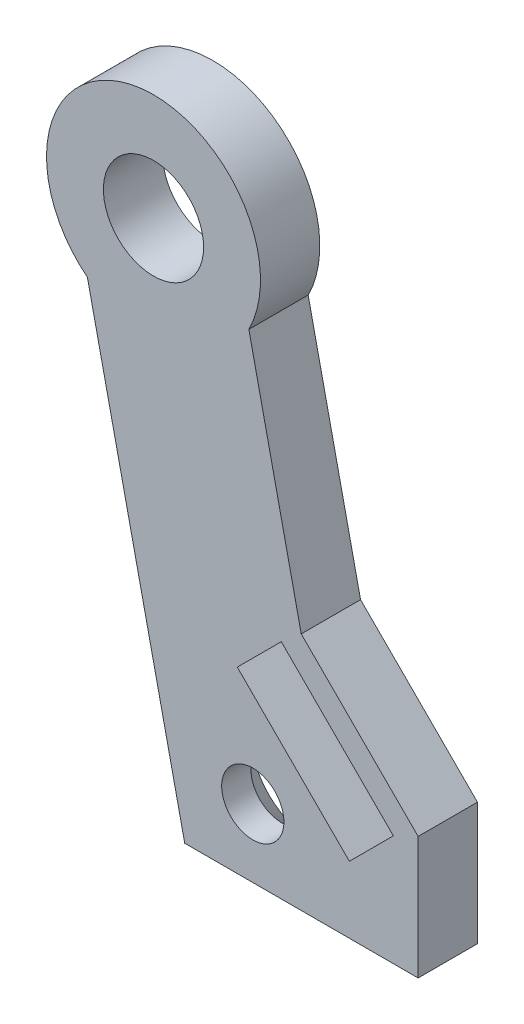
ISO-10303-21;
HEADER;
FILE_DESCRIPTION(('STEP AP214'),'2;1');
FILE_NAME('part.step','',(''),(''),'','','');
FILE_SCHEMA(('AUTOMOTIVE_DESIGN { 1 0 10303 214 1 1 1 1 }'));
ENDSEC;
DATA;
#1=APPLICATION_CONTEXT('core data for automotive mechanical design processes');
#2=APPLICATION_PROTOCOL_DEFINITION('international standard','automotive_design',2000,#1);
#3=PRODUCT_CONTEXT('',#1,'mechanical');
#4=PRODUCT('Part','Part','',(#3));
#5=PRODUCT_RELATED_PRODUCT_CATEGORY('part','',(#4));
#6=PRODUCT_DEFINITION_FORMATION('','',#4);
#7=PRODUCT_DEFINITION_CONTEXT('part definition',#1,'design');
#8=PRODUCT_DEFINITION('design','',#6,#7);
#9=PRODUCT_DEFINITION_SHAPE('','',#8);
#10=(LENGTH_UNIT() NAMED_UNIT(*) SI_UNIT(.MILLI.,.METRE.));
#11=(NAMED_UNIT(*) PLANE_ANGLE_UNIT() SI_UNIT($,.RADIAN.));
#12=(NAMED_UNIT(*) SI_UNIT($,.STERADIAN.) SOLID_ANGLE_UNIT());
#13=UNCERTAINTY_MEASURE_WITH_UNIT(LENGTH_MEASURE(1.E-05),#10,'distance_accuracy_value','');
#14=(GEOMETRIC_REPRESENTATION_CONTEXT(3) GLOBAL_UNCERTAINTY_ASSIGNED_CONTEXT((#13)) GLOBAL_UNIT_ASSIGNED_CONTEXT((#10,
#11,#12)) REPRESENTATION_CONTEXT('',''));
#15=CARTESIAN_POINT('',(0.,0.,0.));
#16=DIRECTION('',(0.,0.,1.));
#17=DIRECTION('',(1.,0.,0.));
#18=AXIS2_PLACEMENT_3D('',#15,#16,#17);
#19=CARTESIAN_POINT('',(8.20970869120796,8.20970869120796,-3.05));
#20=DIRECTION('',(0.707106781186548,0.707106781186547,0.));
#21=DIRECTION('',(-0.707106781186547,0.707106781186548,0.));
#22=AXIS2_PLACEMENT_3D('',#19,#20,#21);
#23=PLANE('',#22);
#24=DIRECTION('',(0.707106781186547,-0.707106781186548,0.));
#25=VECTOR('',#24,1.);
#26=CARTESIAN_POINT('',(8.20970869120796,8.20970869120796,0.));
#27=LINE('',#26,#25);
#28=CARTESIAN_POINT('',(4.96428752719385,11.4551298552221,0.));
#29=VERTEX_POINT('',#28);
#30=CARTESIAN_POINT('',(10.7272077938642,5.6922095885517,0.));
#31=VERTEX_POINT('',#30);
#32=EDGE_CURVE('E190',#29,#31,#27,.T.);
#33=ORIENTED_EDGE('',*,*,#32,.F.);
#34=DIRECTION('',(0.,0.,1.));
#35=VECTOR('',#34,1.);
#36=CARTESIAN_POINT('',(4.96428752719385,11.4551298552221,-3.05));
#37=LINE('',#36,#35);
#38=CARTESIAN_POINT('',(4.96428752719385,11.4551298552221,-3.05));
#39=VERTEX_POINT('',#38);
#40=EDGE_CURVE('E201',#39,#29,#37,.T.);
#41=ORIENTED_EDGE('',*,*,#40,.F.);
#42=DIRECTION('',(0.707106781186547,-0.707106781186548,0.));
#43=VECTOR('',#42,1.);
#44=CARTESIAN_POINT('',(8.20970869120796,8.20970869120796,-3.05));
#45=LINE('',#44,#43);
#46=CARTESIAN_POINT('',(10.7272077938642,5.6922095885517,-3.05));
#47=VERTEX_POINT('',#46);
#48=EDGE_CURVE('E155',#39,#47,#45,.T.);
#49=ORIENTED_EDGE('',*,*,#48,.T.);
#50=DIRECTION('',(0.,0.,1.));
#51=VECTOR('',#50,1.);
#52=CARTESIAN_POINT('',(10.7272077938642,5.6922095885517,-3.05));
#53=LINE('',#52,#51);
#54=EDGE_CURVE('E11',#47,#31,#53,.T.);
#55=ORIENTED_EDGE('',*,*,#54,.T.);
#56=EDGE_LOOP('',(#33,#41,#49,#55));
#57=FACE_BOUND('',#56,.T.);
#58=ADVANCED_FACE('F49',(#57),#23,.F.);
#59=CARTESIAN_POINT('',(2.51749910265625,-2.51749910265625,-3.05));
#60=DIRECTION('',(-0.707106781186548,0.707106781186548,0.));
#61=DIRECTION('',(-0.707106781186548,-0.707106781186548,0.));
#62=AXIS2_PLACEMENT_3D('',#59,#60,#61);
#63=PLANE('',#62);
#64=DIRECTION('',(0.707106781186548,0.707106781186548,0.));
#65=VECTOR('',#64,1.);
#66=CARTESIAN_POINT('',(2.51749910265625,-2.51749910265625,0.));
#67=LINE('',#66,#65);
#68=CARTESIAN_POINT('',(8.46446609406726,3.42946788875475,0.));
#69=VERTEX_POINT('',#68);
#70=EDGE_CURVE('E193',#69,#31,#67,.T.);
#71=ORIENTED_EDGE('',*,*,#70,.T.);
#72=ORIENTED_EDGE('',*,*,#54,.F.);
#73=DIRECTION('',(0.707106781186548,0.707106781186548,0.));
#74=VECTOR('',#73,1.);
#75=CARTESIAN_POINT('',(2.51749910265625,-2.51749910265625,-3.05));
#76=LINE('',#75,#74);
#77=CARTESIAN_POINT('',(8.46446609406726,3.42946788875475,-3.05));
#78=VERTEX_POINT('',#77);
#79=EDGE_CURVE('E139',#78,#47,#76,.T.);
#80=ORIENTED_EDGE('',*,*,#79,.F.);
#81=DIRECTION('',(0.,0.,1.));
#82=VECTOR('',#81,1.);
#83=CARTESIAN_POINT('',(8.46446609406726,3.42946788875475,-3.05));
#84=LINE('',#83,#82);
#85=EDGE_CURVE('E60',#78,#69,#84,.T.);
#86=ORIENTED_EDGE('',*,*,#85,.T.);
#87=EDGE_LOOP('',(#71,#72,#80,#86));
#88=FACE_BOUND('',#87,.T.);
#89=ADVANCED_FACE('F152',(#88),#63,.T.);
#90=CARTESIAN_POINT('',(5.94696699141101,5.94696699141101,-3.05));
#91=DIRECTION('',(-0.707106781186547,-0.707106781186548,0.));
#92=DIRECTION('',(0.707106781186548,-0.707106781186547,0.));
#93=AXIS2_PLACEMENT_3D('',#90,#91,#92);
#94=PLANE('',#93);
#95=DIRECTION('',(-0.707106781186548,0.707106781186547,0.));
#96=VECTOR('',#95,1.);
#97=CARTESIAN_POINT('',(5.94696699141101,5.94696699141101,0.));
#98=LINE('',#97,#96);
#99=CARTESIAN_POINT('',(2.7015458273969,9.19238815542512,0.));
#100=VERTEX_POINT('',#99);
#101=EDGE_CURVE('E146',#69,#100,#98,.T.);
#102=ORIENTED_EDGE('',*,*,#101,.F.);
#103=ORIENTED_EDGE('',*,*,#85,.F.);
#104=DIRECTION('',(-0.707106781186548,0.707106781186547,0.));
#105=VECTOR('',#104,1.);
#106=CARTESIAN_POINT('',(5.94696699141101,5.94696699141101,-3.05));
#107=LINE('',#106,#105);
#108=CARTESIAN_POINT('',(2.7015458273969,9.19238815542512,-3.05));
#109=VERTEX_POINT('',#108);
#110=EDGE_CURVE('E135',#78,#109,#107,.T.);
#111=ORIENTED_EDGE('',*,*,#110,.T.);
#112=DIRECTION('',(0.,0.,1.));
#113=VECTOR('',#112,1.);
#114=CARTESIAN_POINT('',(2.7015458273969,9.19238815542512,-3.05));
#115=LINE('',#114,#113);
#116=EDGE_CURVE('E150',#109,#100,#115,.T.);
#117=ORIENTED_EDGE('',*,*,#116,.T.);
#118=EDGE_LOOP('',(#102,#103,#111,#117));
#119=FACE_BOUND('',#118,.T.);
#120=ADVANCED_FACE('F145',(#119),#94,.F.);
#121=CARTESIAN_POINT('',(-1.60499324348538,27.0243390124817,-3.05));
#122=DIRECTION('',(0.,0.,1.));
#123=DIRECTION('',(-1.,0.,0.));
#124=AXIS2_PLACEMENT_3D('',#121,#122,#123);
#125=CYLINDRICAL_SURFACE('',#124,5.5);
#126=CARTESIAN_POINT('',(-1.60499324348538,27.0243390124817,0.));
#127=DIRECTION('',(0.,0.,1.));
#128=DIRECTION('',(1.,0.,0.));
#129=AXIS2_PLACEMENT_3D('',#126,#127,#128);
#130=CIRCLE('',#129,5.5);
#131=CARTESIAN_POINT('',(3.29686868091154,24.5299954767698,0.));
#132=VERTEX_POINT('',#131);
#133=CARTESIAN_POINT('',(-5.00385651819538,22.7002520059764,0.));
#134=VERTEX_POINT('',#133);
#135=EDGE_CURVE('E165',#132,#134,#130,.T.);
#136=ORIENTED_EDGE('',*,*,#135,.F.);
#137=DIRECTION('',(0.,0.,1.));
#138=VECTOR('',#137,1.);
#139=CARTESIAN_POINT('',(3.29686868091154,24.5299954767698,-3.05));
#140=LINE('',#139,#138);
#141=CARTESIAN_POINT('',(3.29686868091154,24.5299954767698,-3.05));
#142=VERTEX_POINT('',#141);
#143=EDGE_CURVE('E164',#142,#132,#140,.T.);
#144=ORIENTED_EDGE('',*,*,#143,.F.);
#145=CARTESIAN_POINT('',(-1.60499324348538,27.0243390124817,-3.05));
#146=DIRECTION('',(0.,0.,1.));
#147=DIRECTION('',(1.,0.,0.));
#148=AXIS2_PLACEMENT_3D('',#145,#146,#147);
#149=CIRCLE('',#148,5.5);
#150=CARTESIAN_POINT('',(-5.00385651819538,22.7002520059764,-3.05));
#151=VERTEX_POINT('',#150);
#152=EDGE_CURVE('E200',#142,#151,#149,.T.);
#153=ORIENTED_EDGE('',*,*,#152,.T.);
#154=DIRECTION('',(0.,0.,1.));
#155=VECTOR('',#154,1.);
#156=CARTESIAN_POINT('',(-5.00385651819538,22.7002520059764,-3.05));
#157=LINE('',#156,#155);
#158=EDGE_CURVE('E53',#151,#134,#157,.T.);
#159=ORIENTED_EDGE('',*,*,#158,.T.);
#160=EDGE_LOOP('',(#136,#144,#153,#159));
#161=FACE_BOUND('',#160,.T.);
#162=ADVANCED_FACE('F51',(#161),#125,.T.);
#163=CARTESIAN_POINT('',(0.,0.,-3.05));
#164=DIRECTION('',(-0.976555905777287,-0.215263937740399,0.));
#165=DIRECTION('',(0.215263937740399,-0.976555905777287,0.));
#166=AXIS2_PLACEMENT_3D('',#163,#164,#165);
#167=PLANE('',#166);
#168=DIRECTION('',(-0.215263937740399,0.976555905777287,0.));
#169=VECTOR('',#168,1.);
#170=CARTESIAN_POINT('',(0.,0.,0.));
#171=LINE('',#170,#169);
#172=CARTESIAN_POINT('',(0.,0.,0.));
#173=VERTEX_POINT('',#172);
#174=EDGE_CURVE('E169',#173,#134,#171,.T.);
#175=ORIENTED_EDGE('',*,*,#174,.T.);
#176=ORIENTED_EDGE('',*,*,#158,.F.);
#177=DIRECTION('',(-0.215263937740399,0.976555905777287,0.));
#178=VECTOR('',#177,1.);
#179=CARTESIAN_POINT('',(0.,0.,-3.05));
#180=LINE('',#179,#178);
#181=CARTESIAN_POINT('',(0.,0.,-3.05));
#182=VERTEX_POINT('',#181);
#183=EDGE_CURVE('E114',#182,#151,#180,.T.);
#184=ORIENTED_EDGE('',*,*,#183,.F.);
#185=DIRECTION('',(0.,0.,1.));
#186=VECTOR('',#185,1.);
#187=CARTESIAN_POINT('',(0.,0.,-3.05));
#188=LINE('',#187,#186);
#189=EDGE_CURVE('E220',#182,#173,#188,.T.);
#190=ORIENTED_EDGE('',*,*,#189,.T.);
#191=EDGE_LOOP('',(#175,#176,#184,#190));
#192=FACE_BOUND('',#191,.T.);
#193=ADVANCED_FACE('F302',(#192),#167,.T.);
#194=CARTESIAN_POINT('',(0.,0.,-3.05));
#195=DIRECTION('',(0.,1.,0.));
#196=DIRECTION('',(0.,0.,-1.));
#197=AXIS2_PLACEMENT_3D('',#194,#195,#196);
#198=PLANE('',#197);
#199=DIRECTION('',(1.,0.,0.));
#200=VECTOR('',#199,1.);
#201=CARTESIAN_POINT('',(0.,0.,0.));
#202=LINE('',#201,#200);
#203=CARTESIAN_POINT('',(12.,0.,0.));
#204=VERTEX_POINT('',#203);
#205=EDGE_CURVE('E173',#173,#204,#202,.T.);
#206=ORIENTED_EDGE('',*,*,#205,.F.);
#207=ORIENTED_EDGE('',*,*,#189,.F.);
#208=DIRECTION('',(1.,0.,0.));
#209=VECTOR('',#208,1.);
#210=CARTESIAN_POINT('',(0.,0.,-3.05));
#211=LINE('',#210,#209);
#212=CARTESIAN_POINT('',(12.,0.,-3.05));
#213=VERTEX_POINT('',#212);
#214=EDGE_CURVE('E249',#182,#213,#211,.T.);
#215=ORIENTED_EDGE('',*,*,#214,.T.);
#216=DIRECTION('',(0.,0.,1.));
#217=VECTOR('',#216,1.);
#218=CARTESIAN_POINT('',(12.,0.,-3.05));
#219=LINE('',#218,#217);
#220=EDGE_CURVE('E217',#213,#204,#219,.T.);
#221=ORIENTED_EDGE('',*,*,#220,.T.);
#222=EDGE_LOOP('',(#206,#207,#215,#221));
#223=FACE_BOUND('',#222,.T.);
#224=ADVANCED_FACE('F299',(#223),#198,.F.);
#225=CARTESIAN_POINT('',(12.,0.,-3.05));
#226=DIRECTION('',(1.,0.,0.));
#227=DIRECTION('',(0.,0.,1.));
#228=AXIS2_PLACEMENT_3D('',#225,#226,#227);
#229=PLANE('',#228);
#230=DIRECTION('',(0.,-1.,0.));
#231=VECTOR('',#230,1.);
#232=CARTESIAN_POINT('',(12.,0.,0.));
#233=LINE('',#232,#231);
#234=CARTESIAN_POINT('',(12.,6.3039086153561,0.));
#235=VERTEX_POINT('',#234);
#236=EDGE_CURVE('E177',#235,#204,#233,.T.);
#237=ORIENTED_EDGE('',*,*,#236,.T.);
#238=ORIENTED_EDGE('',*,*,#220,.F.);
#239=DIRECTION('',(0.,-1.,0.));
#240=VECTOR('',#239,1.);
#241=CARTESIAN_POINT('',(12.,0.,-3.05));
#242=LINE('',#241,#240);
#243=CARTESIAN_POINT('',(12.,6.3039086153561,-3.05));
#244=VERTEX_POINT('',#243);
#245=EDGE_CURVE('E257',#244,#213,#242,.T.);
#246=ORIENTED_EDGE('',*,*,#245,.F.);
#247=DIRECTION('',(0.,0.,1.));
#248=VECTOR('',#247,1.);
#249=CARTESIAN_POINT('',(12.,6.3039086153561,-3.05));
#250=LINE('',#249,#248);
#251=EDGE_CURVE('E213',#244,#235,#250,.T.);
#252=ORIENTED_EDGE('',*,*,#251,.T.);
#253=EDGE_LOOP('',(#237,#238,#246,#252));
#254=FACE_BOUND('',#253,.T.);
#255=ADVANCED_FACE('F284',(#254),#229,.T.);
#256=CARTESIAN_POINT('',(9.15195430767805,9.15195430767805,-3.05));
#257=DIRECTION('',(0.707106781186548,0.707106781186548,0.));
#258=DIRECTION('',(-0.707106781186548,0.707106781186548,0.));
#259=AXIS2_PLACEMENT_3D('',#256,#257,#258);
#260=PLANE('',#259);
#261=DIRECTION('',(0.707106781186548,-0.707106781186548,0.));
#262=VECTOR('',#261,1.);
#263=CARTESIAN_POINT('',(9.15195430767805,9.15195430767805,0.));
#264=LINE('',#263,#262);
#265=CARTESIAN_POINT('',(5.98959235991435,12.3143162554418,0.));
#266=VERTEX_POINT('',#265);
#267=EDGE_CURVE('E180',#266,#235,#264,.T.);
#268=ORIENTED_EDGE('',*,*,#267,.T.);
#269=ORIENTED_EDGE('',*,*,#251,.F.);
#270=DIRECTION('',(0.707106781186548,-0.707106781186548,0.));
#271=VECTOR('',#270,1.);
#272=CARTESIAN_POINT('',(9.15195430767805,9.15195430767805,-3.05));
#273=LINE('',#272,#271);
#274=CARTESIAN_POINT('',(5.98959235991435,12.3143162554418,-3.05));
#275=VERTEX_POINT('',#274);
#276=EDGE_CURVE('E243',#275,#244,#273,.T.);
#277=ORIENTED_EDGE('',*,*,#276,.F.);
#278=DIRECTION('',(0.,0.,1.));
#279=VECTOR('',#278,1.);
#280=CARTESIAN_POINT('',(5.98959235991435,12.3143162554418,-3.05));
#281=LINE('',#280,#279);
#282=EDGE_CURVE('E209',#275,#266,#281,.T.);
#283=ORIENTED_EDGE('',*,*,#282,.T.);
#284=EDGE_LOOP('',(#268,#269,#277,#283));
#285=FACE_BOUND('',#284,.T.);
#286=ADVANCED_FACE('F279',(#285),#260,.T.);
#287=CARTESIAN_POINT('',(-3.24542116401411,3.24542116401411,-3.05));
#288=DIRECTION('',(-0.707106781186548,0.707106781186547,0.));
#289=DIRECTION('',(-0.707106781186547,-0.707106781186548,0.));
#290=AXIS2_PLACEMENT_3D('',#287,#288,#289);
#291=PLANE('',#290);
#292=DIRECTION('',(0.707106781186547,0.707106781186548,0.));
#293=VECTOR('',#292,1.);
#294=CARTESIAN_POINT('',(-3.24542116401411,3.24542116401411,0.));
#295=LINE('',#294,#293);
#296=EDGE_CURVE('E101',#100,#29,#295,.T.);
#297=ORIENTED_EDGE('',*,*,#296,.F.);
#298=ORIENTED_EDGE('',*,*,#116,.F.);
#299=DIRECTION('',(0.707106781186547,0.707106781186548,0.));
#300=VECTOR('',#299,1.);
#301=CARTESIAN_POINT('',(-3.24542116401411,3.24542116401411,-3.05));
#302=LINE('',#301,#300);
#303=EDGE_CURVE('E69',#109,#39,#302,.T.);
#304=ORIENTED_EDGE('',*,*,#303,.T.);
#305=ORIENTED_EDGE('',*,*,#40,.T.);
#306=EDGE_LOOP('',(#297,#298,#304,#305));
#307=FACE_BOUND('',#306,.T.);
#308=ADVANCED_FACE('F268',(#307),#291,.F.);
#309=CARTESIAN_POINT('',(-1.60499324348538,27.0243390124817,-3.05));
#310=DIRECTION('',(0.,0.,1.));
#311=DIRECTION('',(-1.,0.,0.));
#312=AXIS2_PLACEMENT_3D('',#309,#310,#311);
#313=CYLINDRICAL_SURFACE('',#312,2.575);
#314=CARTESIAN_POINT('',(-1.60499324348538,27.0243390124817,-3.05));
#315=DIRECTION('',(0.,0.,1.));
#316=DIRECTION('',(1.,0.,0.));
#317=AXIS2_PLACEMENT_3D('',#314,#315,#316);
#318=CIRCLE('',#317,2.575);
#319=CARTESIAN_POINT('',(0.970006756514625,27.0243390124817,-3.05));
#320=VERTEX_POINT('',#319);
#321=EDGE_CURVE('E158',#320,#320,#318,.T.);
#322=ORIENTED_EDGE('',*,*,#321,.F.);
#323=EDGE_LOOP('',(#322));
#324=FACE_BOUND('',#323,.T.);
#325=CARTESIAN_POINT('',(-1.60499324348538,27.0243390124817,0.));
#326=DIRECTION('',(0.,0.,1.));
#327=DIRECTION('',(1.,0.,0.));
#328=AXIS2_PLACEMENT_3D('',#325,#326,#327);
#329=CIRCLE('',#328,2.575);
#330=CARTESIAN_POINT('',(0.970006756514625,27.0243390124817,0.));
#331=VERTEX_POINT('',#330);
#332=EDGE_CURVE('E186',#331,#331,#329,.T.);
#333=ORIENTED_EDGE('',*,*,#332,.T.);
#334=EDGE_LOOP('',(#333));
#335=FACE_BOUND('',#334,.T.);
#336=ADVANCED_FACE('F265',(#324,#335),#313,.F.);
#337=CARTESIAN_POINT('',(8.30072519910674,1.82974347079327,-3.05));
#338=DIRECTION('',(0.976555905777289,0.215263937740391,0.));
#339=DIRECTION('',(-0.215263937740391,0.976555905777289,0.));
#340=AXIS2_PLACEMENT_3D('',#337,#338,#339);
#341=PLANE('',#340);
#342=DIRECTION('',(0.215263937740391,-0.976555905777289,0.));
#343=VECTOR('',#342,1.);
#344=CARTESIAN_POINT('',(8.30072519910674,1.82974347079327,0.));
#345=LINE('',#344,#343);
#346=EDGE_CURVE('E183',#132,#266,#345,.T.);
#347=ORIENTED_EDGE('',*,*,#346,.T.);
#348=ORIENTED_EDGE('',*,*,#282,.F.);
#349=DIRECTION('',(0.215263937740391,-0.976555905777289,0.));
#350=VECTOR('',#349,1.);
#351=CARTESIAN_POINT('',(8.30072519910674,1.82974347079327,-3.05));
#352=LINE('',#351,#350);
#353=EDGE_CURVE('E240',#142,#275,#352,.T.);
#354=ORIENTED_EDGE('',*,*,#353,.F.);
#355=ORIENTED_EDGE('',*,*,#143,.T.);
#356=EDGE_LOOP('',(#347,#348,#354,#355));
#357=FACE_BOUND('',#356,.T.);
#358=ADVANCED_FACE('F239',(#357),#341,.T.);
#359=CARTESIAN_POINT('',(0.,0.,-3.05));
#360=DIRECTION('',(0.,0.,-1.));
#361=DIRECTION('',(1.,0.,0.));
#362=AXIS2_PLACEMENT_3D('',#359,#360,#361);
#363=PLANE('',#362);
#364=CARTESIAN_POINT('',(3.5,3.5,-3.05));
#365=DIRECTION('',(0.,0.,1.));
#366=DIRECTION('',(1.,0.,0.));
#367=AXIS2_PLACEMENT_3D('',#364,#365,#366);
#368=CIRCLE('',#367,3.15);
#369=CARTESIAN_POINT('',(6.65,3.5,-3.05));
#370=VERTEX_POINT('',#369);
#371=EDGE_CURVE('E476',#370,#370,#368,.T.);
#372=ORIENTED_EDGE('',*,*,#371,.T.);
#373=EDGE_LOOP('',(#372));
#374=FACE_BOUND('',#373,.T.);
#375=ORIENTED_EDGE('',*,*,#152,.F.);
#376=ORIENTED_EDGE('',*,*,#353,.T.);
#377=ORIENTED_EDGE('',*,*,#276,.T.);
#378=ORIENTED_EDGE('',*,*,#245,.T.);
#379=ORIENTED_EDGE('',*,*,#214,.F.);
#380=ORIENTED_EDGE('',*,*,#183,.T.);
#381=EDGE_LOOP('',(#375,#376,#377,#378,#379,#380));
#382=FACE_BOUND('',#381,.T.);
#383=ORIENTED_EDGE('',*,*,#321,.T.);
#384=EDGE_LOOP('',(#383));
#385=FACE_BOUND('',#384,.T.);
#386=ORIENTED_EDGE('',*,*,#48,.F.);
#387=ORIENTED_EDGE('',*,*,#303,.F.);
#388=ORIENTED_EDGE('',*,*,#110,.F.);
#389=ORIENTED_EDGE('',*,*,#79,.T.);
#390=EDGE_LOOP('',(#386,#387,#388,#389));
#391=FACE_BOUND('',#390,.T.);
#392=ADVANCED_FACE('F137',(#374,#382,#385,#391),#363,.T.);
#393=CARTESIAN_POINT('',(0.,0.,0.));
#394=DIRECTION('',(0.,0.,-1.));
#395=DIRECTION('',(1.,0.,0.));
#396=AXIS2_PLACEMENT_3D('',#393,#394,#395);
#397=PLANE('',#396);
#398=CARTESIAN_POINT('',(3.5,3.5,0.));
#399=DIRECTION('',(0.,0.,1.));
#400=DIRECTION('',(1.,0.,0.));
#401=AXIS2_PLACEMENT_3D('',#398,#399,#400);
#402=CIRCLE('',#401,1.6);
#403=CARTESIAN_POINT('',(5.1,3.5,0.));
#404=VERTEX_POINT('',#403);
#405=EDGE_CURVE('E170',#404,#404,#402,.T.);
#406=ORIENTED_EDGE('',*,*,#405,.F.);
#407=EDGE_LOOP('',(#406));
#408=FACE_BOUND('',#407,.T.);
#409=ORIENTED_EDGE('',*,*,#135,.T.);
#410=ORIENTED_EDGE('',*,*,#174,.F.);
#411=ORIENTED_EDGE('',*,*,#205,.T.);
#412=ORIENTED_EDGE('',*,*,#236,.F.);
#413=ORIENTED_EDGE('',*,*,#267,.F.);
#414=ORIENTED_EDGE('',*,*,#346,.F.);
#415=EDGE_LOOP('',(#409,#410,#411,#412,#413,#414));
#416=FACE_BOUND('',#415,.T.);
#417=ORIENTED_EDGE('',*,*,#332,.F.);
#418=EDGE_LOOP('',(#417));
#419=FACE_BOUND('',#418,.T.);
#420=ORIENTED_EDGE('',*,*,#32,.T.);
#421=ORIENTED_EDGE('',*,*,#70,.F.);
#422=ORIENTED_EDGE('',*,*,#101,.T.);
#423=ORIENTED_EDGE('',*,*,#296,.T.);
#424=EDGE_LOOP('',(#420,#421,#422,#423));
#425=FACE_BOUND('',#424,.T.);
#426=ADVANCED_FACE('F233',(#408,#416,#419,#425),#397,.F.);
#427=CARTESIAN_POINT('',(3.5,3.5,-3.05));
#428=DIRECTION('',(0.,0.,-1.));
#429=DIRECTION('',(1.,0.,0.));
#430=AXIS2_PLACEMENT_3D('',#427,#428,#429);
#431=CYLINDRICAL_SURFACE('',#430,1.6);
#432=ORIENTED_EDGE('',*,*,#405,.T.);
#433=EDGE_LOOP('',(#432));
#434=FACE_BOUND('',#433,.T.);
#435=CARTESIAN_POINT('',(3.5,3.5,-1.5));
#436=DIRECTION('',(0.,0.,1.));
#437=DIRECTION('',(1.,0.,0.));
#438=AXIS2_PLACEMENT_3D('',#435,#436,#437);
#439=CIRCLE('',#438,1.6);
#440=CARTESIAN_POINT('',(5.1,3.5,-1.5));
#441=VERTEX_POINT('',#440);
#442=EDGE_CURVE('E479',#441,#441,#439,.T.);
#443=ORIENTED_EDGE('',*,*,#442,.F.);
#444=EDGE_LOOP('',(#443));
#445=FACE_BOUND('',#444,.T.);
#446=ADVANCED_FACE('F272',(#434,#445),#431,.F.);
#447=CARTESIAN_POINT('',(3.5,3.5,-3.05));
#448=DIRECTION('',(0.,0.,-1.));
#449=DIRECTION('',(1.,0.,0.));
#450=AXIS2_PLACEMENT_3D('',#447,#448,#449);
#451=CONICAL_SURFACE('',#450,3.15,0.785398163397449);
#452=ORIENTED_EDGE('',*,*,#442,.T.);
#453=EDGE_LOOP('',(#452));
#454=FACE_BOUND('',#453,.T.);
#455=ORIENTED_EDGE('',*,*,#371,.F.);
#456=EDGE_LOOP('',(#455));
#457=FACE_BOUND('',#456,.T.);
#458=ADVANCED_FACE('F381',(#454,#457),#451,.F.);
#459=CLOSED_SHELL('',(#58,#89,#120,#162,#193,#224,#255,#286,#308,#336,#358,#392,#426,#446,#458));
#460=MANIFOLD_SOLID_BREP('B2',#459);
#461=ADVANCED_BREP_SHAPE_REPRESENTATION('',(#18,#460),#14);
#462=SHAPE_DEFINITION_REPRESENTATION(#9,#461);
ENDSEC;
END-ISO-10303-21;
